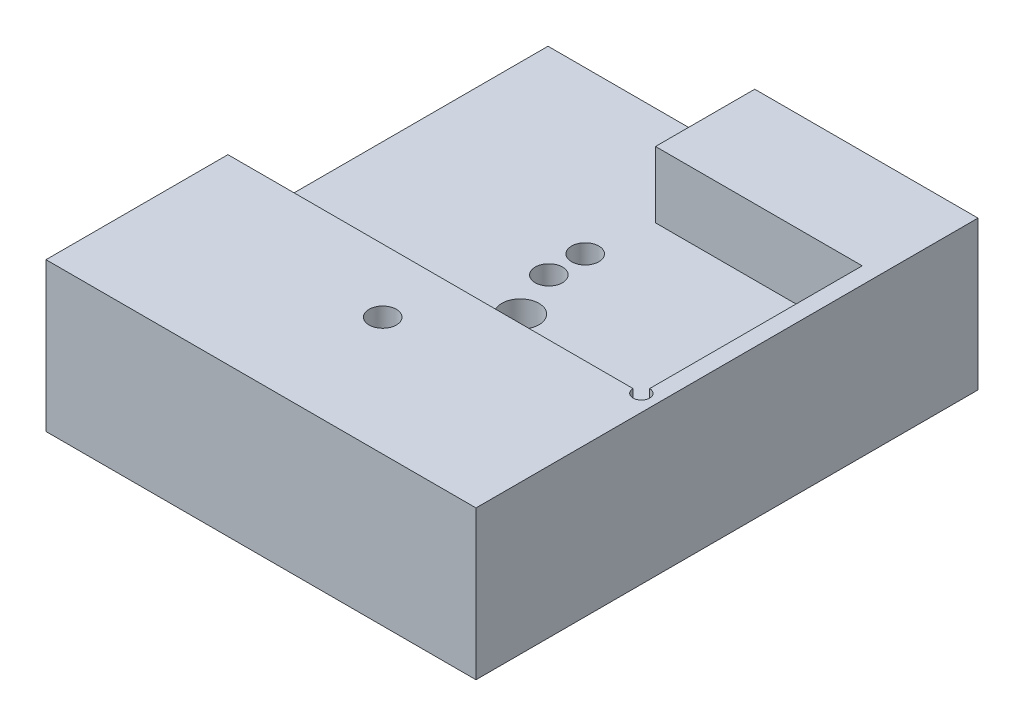
ISO-10303-21;
HEADER;
FILE_DESCRIPTION(('STEP AP214'),'2;1');
FILE_NAME('part.step','',(''),(''),'','','');
FILE_SCHEMA(('AUTOMOTIVE_DESIGN { 1 0 10303 214 1 1 1 1 }'));
ENDSEC;
DATA;
#1=APPLICATION_CONTEXT('core data for automotive mechanical design processes');
#2=APPLICATION_PROTOCOL_DEFINITION('international standard','automotive_design',2000,#1);
#3=PRODUCT_CONTEXT('',#1,'mechanical');
#4=PRODUCT('Part','Part','',(#3));
#5=PRODUCT_RELATED_PRODUCT_CATEGORY('part','',(#4));
#6=PRODUCT_DEFINITION_FORMATION('','',#4);
#7=PRODUCT_DEFINITION_CONTEXT('part definition',#1,'design');
#8=PRODUCT_DEFINITION('design','',#6,#7);
#9=PRODUCT_DEFINITION_SHAPE('','',#8);
#10=(LENGTH_UNIT() NAMED_UNIT(*) SI_UNIT(.MILLI.,.METRE.));
#11=(NAMED_UNIT(*) PLANE_ANGLE_UNIT() SI_UNIT($,.RADIAN.));
#12=(NAMED_UNIT(*) SI_UNIT($,.STERADIAN.) SOLID_ANGLE_UNIT());
#13=UNCERTAINTY_MEASURE_WITH_UNIT(LENGTH_MEASURE(1.E-05),#10,'distance_accuracy_value','');
#14=(GEOMETRIC_REPRESENTATION_CONTEXT(3) GLOBAL_UNCERTAINTY_ASSIGNED_CONTEXT((#13)) GLOBAL_UNIT_ASSIGNED_CONTEXT((#10,
#11,#12)) REPRESENTATION_CONTEXT('',''));
#15=CARTESIAN_POINT('',(0.,0.,0.));
#16=DIRECTION('',(0.,0.,1.));
#17=DIRECTION('',(1.,0.,0.));
#18=AXIS2_PLACEMENT_3D('',#15,#16,#17);
#19=CARTESIAN_POINT('',(-0.999999999999997,6.,-5.855));
#20=DIRECTION('',(0.,1.,0.));
#21=DIRECTION('',(0.,0.,1.));
#22=AXIS2_PLACEMENT_3D('',#19,#20,#21);
#23=CYLINDRICAL_SURFACE('',#22,1.64999999999999);
#24=CARTESIAN_POINT('',(-0.999999999999997,6.,-5.855));
#25=DIRECTION('',(0.,1.,0.));
#26=DIRECTION('',(0.,0.,1.));
#27=AXIS2_PLACEMENT_3D('',#24,#25,#26);
#28=CIRCLE('',#27,1.64999999999999);
#29=CARTESIAN_POINT('',(-0.999999999999997,6.,-4.20500000000001));
#30=VERTEX_POINT('',#29);
#31=EDGE_CURVE('E249',#30,#30,#28,.T.);
#32=ORIENTED_EDGE('',*,*,#31,.T.);
#33=EDGE_LOOP('',(#32));
#34=FACE_BOUND('',#33,.T.);
#35=CARTESIAN_POINT('',(-0.999999999999997,2.,-5.855));
#36=DIRECTION('',(0.,-1.,0.));
#37=DIRECTION('',(0.,0.,-1.));
#38=AXIS2_PLACEMENT_3D('',#35,#36,#37);
#39=CIRCLE('',#38,1.64999999999999);
#40=CARTESIAN_POINT('',(-0.999999999999997,2.,-7.50499999999999));
#41=VERTEX_POINT('',#40);
#42=EDGE_CURVE('E250',#41,#41,#39,.F.);
#43=ORIENTED_EDGE('',*,*,#42,.F.);
#44=EDGE_LOOP('',(#43));
#45=FACE_BOUND('',#44,.T.);
#46=ADVANCED_FACE('F41',(#34,#45),#23,.F.);
#47=CARTESIAN_POINT('',(25.,0.,-13.355));
#48=DIRECTION('',(0.,0.,1.));
#49=DIRECTION('',(1.,0.,0.));
#50=AXIS2_PLACEMENT_3D('',#47,#48,#49);
#51=PLANE('',#50);
#52=DIRECTION('',(1.,0.,0.));
#53=VECTOR('',#52,1.);
#54=CARTESIAN_POINT('',(25.,14.,-13.355));
#55=LINE('',#54,#53);
#56=CARTESIAN_POINT('',(0.,14.,-13.355));
#57=VERTEX_POINT('',#56);
#58=CARTESIAN_POINT('',(25.,14.,-13.355));
#59=VERTEX_POINT('',#58);
#60=EDGE_CURVE('E279',#57,#59,#55,.T.);
#61=ORIENTED_EDGE('',*,*,#60,.F.);
#62=DIRECTION('',(0.,1.,0.));
#63=VECTOR('',#62,1.);
#64=CARTESIAN_POINT('',(0.,6.,-13.355));
#65=LINE('',#64,#63);
#66=CARTESIAN_POINT('',(0.,6.,-13.355));
#67=VERTEX_POINT('',#66);
#68=EDGE_CURVE('E276',#67,#57,#65,.T.);
#69=ORIENTED_EDGE('',*,*,#68,.F.);
#70=DIRECTION('',(-1.,0.,0.));
#71=VECTOR('',#70,1.);
#72=CARTESIAN_POINT('',(-25.,6.,-13.355));
#73=LINE('',#72,#71);
#74=CARTESIAN_POINT('',(25.,6.,-13.355));
#75=VERTEX_POINT('',#74);
#76=EDGE_CURVE('E266',#75,#67,#73,.T.);
#77=ORIENTED_EDGE('',*,*,#76,.F.);
#78=DIRECTION('',(0.,1.,0.));
#79=VECTOR('',#78,1.);
#80=CARTESIAN_POINT('',(25.,0.,-13.355));
#81=LINE('',#80,#79);
#82=EDGE_CURVE('E270',#75,#59,#81,.T.);
#83=ORIENTED_EDGE('',*,*,#82,.T.);
#84=EDGE_LOOP('',(#61,#69,#77,#83));
#85=FACE_BOUND('',#84,.T.);
#86=ADVANCED_FACE('F371',(#85),#51,.T.);
#87=CARTESIAN_POINT('',(0.,14.,0.));
#88=DIRECTION('',(0.,1.,0.));
#89=DIRECTION('',(0.,0.,1.));
#90=AXIS2_PLACEMENT_3D('',#87,#88,#89);
#91=PLANE('',#90);
#92=CARTESIAN_POINT('',(1.38,14.,21.0159064092061));
#93=DIRECTION('',(0.,-1.,0.));
#94=DIRECTION('',(0.,0.,-1.));
#95=AXIS2_PLACEMENT_3D('',#92,#93,#94);
#96=CIRCLE('',#95,1.65);
#97=CARTESIAN_POINT('',(1.38,14.,19.3659064092061));
#98=VERTEX_POINT('',#97);
#99=EDGE_CURVE('E689',#98,#98,#96,.T.);
#100=ORIENTED_EDGE('',*,*,#99,.T.);
#101=EDGE_LOOP('',(#100));
#102=FACE_BOUND('',#101,.T.);
#103=CARTESIAN_POINT('',(25.,14.,13.355));
#104=DIRECTION('',(0.,1.,0.));
#105=DIRECTION('',(0.,0.,1.));
#106=AXIS2_PLACEMENT_3D('',#103,#104,#105);
#107=CIRCLE('',#106,1.);
#108=CARTESIAN_POINT('',(24.,14.,13.355));
#109=VERTEX_POINT('',#108);
#110=CARTESIAN_POINT('',(25.,14.,12.355));
#111=VERTEX_POINT('',#110);
#112=EDGE_CURVE('E257',#109,#111,#107,.T.);
#113=ORIENTED_EDGE('',*,*,#112,.F.);
#114=DIRECTION('',(-1.,0.,0.));
#115=VECTOR('',#114,1.);
#116=CARTESIAN_POINT('',(-25.,14.,13.355));
#117=LINE('',#116,#115);
#118=CARTESIAN_POINT('',(-25.,14.,13.355));
#119=VERTEX_POINT('',#118);
#120=EDGE_CURVE('E273',#109,#119,#117,.T.);
#121=ORIENTED_EDGE('',*,*,#120,.T.);
#122=DIRECTION('',(0.,0.,1.));
#123=VECTOR('',#122,1.);
#124=CARTESIAN_POINT('',(-25.,14.,15.355));
#125=LINE('',#124,#123);
#126=CARTESIAN_POINT('',(-25.,14.,35.355));
#127=VERTEX_POINT('',#126);
#128=EDGE_CURVE('E280',#119,#127,#125,.T.);
#129=ORIENTED_EDGE('',*,*,#128,.T.);
#130=DIRECTION('',(-1.,0.,0.));
#131=VECTOR('',#130,1.);
#132=CARTESIAN_POINT('',(27.,14.,35.355));
#133=LINE('',#132,#131);
#134=CARTESIAN_POINT('',(27.,14.,35.355));
#135=VERTEX_POINT('',#134);
#136=EDGE_CURVE('E311',#135,#127,#133,.T.);
#137=ORIENTED_EDGE('',*,*,#136,.F.);
#138=DIRECTION('',(0.,0.,-1.));
#139=VECTOR('',#138,1.);
#140=CARTESIAN_POINT('',(27.,14.,15.355));
#141=LINE('',#140,#139);
#142=CARTESIAN_POINT('',(27.,14.,-25.355));
#143=VERTEX_POINT('',#142);
#144=EDGE_CURVE('E277',#135,#143,#141,.T.);
#145=ORIENTED_EDGE('',*,*,#144,.T.);
#146=DIRECTION('',(1.,0.,0.));
#147=VECTOR('',#146,1.);
#148=CARTESIAN_POINT('',(0.,14.,-25.355));
#149=LINE('',#148,#147);
#150=CARTESIAN_POINT('',(0.,14.,-25.355));
#151=VERTEX_POINT('',#150);
#152=EDGE_CURVE('E297',#151,#143,#149,.T.);
#153=ORIENTED_EDGE('',*,*,#152,.F.);
#154=DIRECTION('',(0.,0.,-1.));
#155=VECTOR('',#154,1.);
#156=CARTESIAN_POINT('',(0.,14.,-13.355));
#157=LINE('',#156,#155);
#158=EDGE_CURVE('E291',#57,#151,#157,.T.);
#159=ORIENTED_EDGE('',*,*,#158,.F.);
#160=ORIENTED_EDGE('',*,*,#60,.T.);
#161=DIRECTION('',(0.,0.,1.));
#162=VECTOR('',#161,1.);
#163=CARTESIAN_POINT('',(25.,14.,13.355));
#164=LINE('',#163,#162);
#165=EDGE_CURVE('E262',#59,#111,#164,.T.);
#166=ORIENTED_EDGE('',*,*,#165,.T.);
#167=EDGE_LOOP('',(#113,#121,#129,#137,#145,#153,#159,#160,#166));
#168=FACE_BOUND('',#167,.T.);
#169=ADVANCED_FACE('F377',(#102,#168),#91,.T.);
#170=CARTESIAN_POINT('',(-25.,6.,-13.355));
#171=DIRECTION('',(1.,0.,0.));
#172=DIRECTION('',(0.,0.,-1.));
#173=AXIS2_PLACEMENT_3D('',#170,#171,#172);
#174=PLANE('',#173);
#175=DIRECTION('',(0.,0.,1.));
#176=VECTOR('',#175,1.);
#177=CARTESIAN_POINT('',(-25.,6.,-13.355));
#178=LINE('',#177,#176);
#179=CARTESIAN_POINT('',(-25.,6.,-25.355));
#180=VERTEX_POINT('',#179);
#181=CARTESIAN_POINT('',(-25.,6.,13.355));
#182=VERTEX_POINT('',#181);
#183=EDGE_CURVE('E263',#180,#182,#178,.T.);
#184=ORIENTED_EDGE('',*,*,#183,.F.);
#185=DIRECTION('',(0.,1.,0.));
#186=VECTOR('',#185,1.);
#187=CARTESIAN_POINT('',(-25.,0.,-25.355));
#188=LINE('',#187,#186);
#189=CARTESIAN_POINT('',(-25.,-4.,-25.355));
#190=VERTEX_POINT('',#189);
#191=EDGE_CURVE('E290',#190,#180,#188,.T.);
#192=ORIENTED_EDGE('',*,*,#191,.F.);
#193=DIRECTION('',(0.,0.,-1.));
#194=VECTOR('',#193,1.);
#195=CARTESIAN_POINT('',(-25.,-4.,35.355));
#196=LINE('',#195,#194);
#197=CARTESIAN_POINT('',(-25.,-4.,35.355));
#198=VERTEX_POINT('',#197);
#199=EDGE_CURVE('E243',#198,#190,#196,.T.);
#200=ORIENTED_EDGE('',*,*,#199,.F.);
#201=DIRECTION('',(0.,-1.,0.));
#202=VECTOR('',#201,1.);
#203=CARTESIAN_POINT('',(-25.,14.,35.355));
#204=LINE('',#203,#202);
#205=EDGE_CURVE('E308',#127,#198,#204,.T.);
#206=ORIENTED_EDGE('',*,*,#205,.F.);
#207=ORIENTED_EDGE('',*,*,#128,.F.);
#208=DIRECTION('',(0.,1.,0.));
#209=VECTOR('',#208,1.);
#210=CARTESIAN_POINT('',(-25.,0.,13.355));
#211=LINE('',#210,#209);
#212=EDGE_CURVE('E265',#182,#119,#211,.T.);
#213=ORIENTED_EDGE('',*,*,#212,.F.);
#214=EDGE_LOOP('',(#184,#192,#200,#206,#207,#213));
#215=FACE_BOUND('',#214,.T.);
#216=ADVANCED_FACE('F510',(#215),#174,.F.);
#217=CARTESIAN_POINT('',(0.,6.,0.));
#218=DIRECTION('',(0.,1.,0.));
#219=DIRECTION('',(0.,0.,1.));
#220=AXIS2_PLACEMENT_3D('',#217,#218,#219);
#221=PLANE('',#220);
#222=CARTESIAN_POINT('',(1.378,6.,4.36948924411358));
#223=DIRECTION('',(0.,1.,0.));
#224=DIRECTION('',(0.,0.,1.));
#225=AXIS2_PLACEMENT_3D('',#222,#223,#224);
#226=CIRCLE('',#225,2.25);
#227=CARTESIAN_POINT('',(1.378,6.,6.61948924411359));
#228=VERTEX_POINT('',#227);
#229=EDGE_CURVE('E208',#228,#228,#226,.T.);
#230=ORIENTED_EDGE('',*,*,#229,.F.);
#231=EDGE_LOOP('',(#230));
#232=FACE_BOUND('',#231,.T.);
#233=CARTESIAN_POINT('',(-1.,6.,-1.455));
#234=DIRECTION('',(0.,1.,0.));
#235=DIRECTION('',(0.,0.,1.));
#236=AXIS2_PLACEMENT_3D('',#233,#234,#235);
#237=CIRCLE('',#236,1.64999999999999);
#238=CARTESIAN_POINT('',(-1.,6.,0.194999999999991));
#239=VERTEX_POINT('',#238);
#240=EDGE_CURVE('E321',#239,#239,#237,.T.);
#241=ORIENTED_EDGE('',*,*,#240,.F.);
#242=EDGE_LOOP('',(#241));
#243=FACE_BOUND('',#242,.T.);
#244=DIRECTION('',(1.,0.,0.));
#245=VECTOR('',#244,1.);
#246=CARTESIAN_POINT('',(-25.,6.,13.355));
#247=LINE('',#246,#245);
#248=CARTESIAN_POINT('',(24.,6.,13.355));
#249=VERTEX_POINT('',#248);
#250=EDGE_CURVE('E258',#182,#249,#247,.T.);
#251=ORIENTED_EDGE('',*,*,#250,.T.);
#252=CARTESIAN_POINT('',(25.,6.,13.355));
#253=DIRECTION('',(0.,1.,0.));
#254=DIRECTION('',(0.,0.,1.));
#255=AXIS2_PLACEMENT_3D('',#252,#253,#254);
#256=CIRCLE('',#255,1.);
#257=CARTESIAN_POINT('',(25.,6.,12.355));
#258=VERTEX_POINT('',#257);
#259=EDGE_CURVE('E88',#258,#249,#256,.F.);
#260=ORIENTED_EDGE('',*,*,#259,.F.);
#261=DIRECTION('',(0.,0.,-1.));
#262=VECTOR('',#261,1.);
#263=CARTESIAN_POINT('',(25.,6.,-13.355));
#264=LINE('',#263,#262);
#265=EDGE_CURVE('E261',#258,#75,#264,.T.);
#266=ORIENTED_EDGE('',*,*,#265,.T.);
#267=ORIENTED_EDGE('',*,*,#76,.T.);
#268=DIRECTION('',(0.,0.,1.));
#269=VECTOR('',#268,1.);
#270=CARTESIAN_POINT('',(0.,6.,-13.355));
#271=LINE('',#270,#269);
#272=CARTESIAN_POINT('',(0.,6.,-25.355));
#273=VERTEX_POINT('',#272);
#274=EDGE_CURVE('E288',#273,#67,#271,.T.);
#275=ORIENTED_EDGE('',*,*,#274,.F.);
#276=DIRECTION('',(1.,0.,0.));
#277=VECTOR('',#276,1.);
#278=CARTESIAN_POINT('',(-25.,6.,-25.355));
#279=LINE('',#278,#277);
#280=EDGE_CURVE('E303',#180,#273,#279,.T.);
#281=ORIENTED_EDGE('',*,*,#280,.F.);
#282=ORIENTED_EDGE('',*,*,#183,.T.);
#283=EDGE_LOOP('',(#251,#260,#266,#267,#275,#281,#282));
#284=FACE_BOUND('',#283,.T.);
#285=ORIENTED_EDGE('',*,*,#31,.F.);
#286=EDGE_LOOP('',(#285));
#287=FACE_BOUND('',#286,.T.);
#288=ADVANCED_FACE('F505',(#232,#243,#284,#287),#221,.T.);
#289=CARTESIAN_POINT('',(27.,0.,15.355));
#290=DIRECTION('',(1.,0.,0.));
#291=DIRECTION('',(0.,0.,-1.));
#292=AXIS2_PLACEMENT_3D('',#289,#290,#291);
#293=PLANE('',#292);
#294=DIRECTION('',(0.,1.,0.));
#295=VECTOR('',#294,1.);
#296=CARTESIAN_POINT('',(27.,0.,35.355));
#297=LINE('',#296,#295);
#298=CARTESIAN_POINT('',(27.,-4.,35.355));
#299=VERTEX_POINT('',#298);
#300=EDGE_CURVE('E296',#299,#135,#297,.T.);
#301=ORIENTED_EDGE('',*,*,#300,.F.);
#302=DIRECTION('',(0.,0.,1.));
#303=VECTOR('',#302,1.);
#304=CARTESIAN_POINT('',(27.,-4.,-25.355));
#305=LINE('',#304,#303);
#306=CARTESIAN_POINT('',(27.,-4.,-25.355));
#307=VERTEX_POINT('',#306);
#308=EDGE_CURVE('E237',#307,#299,#305,.T.);
#309=ORIENTED_EDGE('',*,*,#308,.F.);
#310=DIRECTION('',(0.,-1.,0.));
#311=VECTOR('',#310,1.);
#312=CARTESIAN_POINT('',(27.,14.,-25.355));
#313=LINE('',#312,#311);
#314=EDGE_CURVE('E294',#143,#307,#313,.T.);
#315=ORIENTED_EDGE('',*,*,#314,.F.);
#316=ORIENTED_EDGE('',*,*,#144,.F.);
#317=EDGE_LOOP('',(#301,#309,#315,#316));
#318=FACE_BOUND('',#317,.T.);
#319=ADVANCED_FACE('F509',(#318),#293,.T.);
#320=CARTESIAN_POINT('',(-25.,0.,13.355));
#321=DIRECTION('',(0.,0.,-1.));
#322=DIRECTION('',(-1.,0.,0.));
#323=AXIS2_PLACEMENT_3D('',#320,#321,#322);
#324=PLANE('',#323);
#325=DIRECTION('',(0.,1.,0.));
#326=VECTOR('',#325,1.);
#327=CARTESIAN_POINT('',(24.,3.17157287525381,13.355));
#328=LINE('',#327,#326);
#329=EDGE_CURVE('E310',#249,#109,#328,.T.);
#330=ORIENTED_EDGE('',*,*,#329,.F.);
#331=ORIENTED_EDGE('',*,*,#250,.F.);
#332=ORIENTED_EDGE('',*,*,#212,.T.);
#333=ORIENTED_EDGE('',*,*,#120,.F.);
#334=EDGE_LOOP('',(#330,#331,#332,#333));
#335=FACE_BOUND('',#334,.T.);
#336=ADVANCED_FACE('F544',(#335),#324,.T.);
#337=CARTESIAN_POINT('',(25.,0.,13.355));
#338=DIRECTION('',(-1.,0.,0.));
#339=DIRECTION('',(0.,0.,1.));
#340=AXIS2_PLACEMENT_3D('',#337,#338,#339);
#341=PLANE('',#340);
#342=DIRECTION('',(0.,1.,0.));
#343=VECTOR('',#342,1.);
#344=CARTESIAN_POINT('',(25.,3.17157287525381,12.355));
#345=LINE('',#344,#343);
#346=EDGE_CURVE('E255',#111,#258,#345,.F.);
#347=ORIENTED_EDGE('',*,*,#346,.F.);
#348=ORIENTED_EDGE('',*,*,#165,.F.);
#349=ORIENTED_EDGE('',*,*,#82,.F.);
#350=ORIENTED_EDGE('',*,*,#265,.F.);
#351=EDGE_LOOP('',(#347,#348,#349,#350));
#352=FACE_BOUND('',#351,.T.);
#353=ADVANCED_FACE('F387',(#352),#341,.T.);
#354=CARTESIAN_POINT('',(0.,0.,0.));
#355=DIRECTION('',(-1.,0.,0.));
#356=DIRECTION('',(0.,0.,1.));
#357=AXIS2_PLACEMENT_3D('',#354,#355,#356);
#358=PLANE('',#357);
#359=ORIENTED_EDGE('',*,*,#68,.T.);
#360=ORIENTED_EDGE('',*,*,#158,.T.);
#361=DIRECTION('',(0.,1.,0.));
#362=VECTOR('',#361,1.);
#363=CARTESIAN_POINT('',(0.,6.,-25.355));
#364=LINE('',#363,#362);
#365=EDGE_CURVE('E300',#273,#151,#364,.T.);
#366=ORIENTED_EDGE('',*,*,#365,.F.);
#367=ORIENTED_EDGE('',*,*,#274,.T.);
#368=EDGE_LOOP('',(#359,#360,#366,#367));
#369=FACE_BOUND('',#368,.T.);
#370=ADVANCED_FACE('F383',(#369),#358,.T.);
#371=CARTESIAN_POINT('',(0.,0.,-25.355));
#372=DIRECTION('',(0.,0.,-1.));
#373=DIRECTION('',(-1.,0.,0.));
#374=AXIS2_PLACEMENT_3D('',#371,#372,#373);
#375=PLANE('',#374);
#376=ORIENTED_EDGE('',*,*,#191,.T.);
#377=ORIENTED_EDGE('',*,*,#280,.T.);
#378=ORIENTED_EDGE('',*,*,#365,.T.);
#379=ORIENTED_EDGE('',*,*,#152,.T.);
#380=ORIENTED_EDGE('',*,*,#314,.T.);
#381=DIRECTION('',(1.,0.,0.));
#382=VECTOR('',#381,1.);
#383=CARTESIAN_POINT('',(-25.,-4.,-25.355));
#384=LINE('',#383,#382);
#385=EDGE_CURVE('E246',#190,#307,#384,.T.);
#386=ORIENTED_EDGE('',*,*,#385,.F.);
#387=EDGE_LOOP('',(#376,#377,#378,#379,#380,#386));
#388=FACE_BOUND('',#387,.T.);
#389=ADVANCED_FACE('F386',(#388),#375,.T.);
#390=CARTESIAN_POINT('',(0.,0.,35.355));
#391=DIRECTION('',(0.,0.,1.));
#392=DIRECTION('',(1.,0.,0.));
#393=AXIS2_PLACEMENT_3D('',#390,#391,#392);
#394=PLANE('',#393);
#395=ORIENTED_EDGE('',*,*,#205,.T.);
#396=DIRECTION('',(-1.,0.,0.));
#397=VECTOR('',#396,1.);
#398=CARTESIAN_POINT('',(27.,-4.,35.355));
#399=LINE('',#398,#397);
#400=EDGE_CURVE('E240',#299,#198,#399,.T.);
#401=ORIENTED_EDGE('',*,*,#400,.F.);
#402=ORIENTED_EDGE('',*,*,#300,.T.);
#403=ORIENTED_EDGE('',*,*,#136,.T.);
#404=EDGE_LOOP('',(#395,#401,#402,#403));
#405=FACE_BOUND('',#404,.T.);
#406=ADVANCED_FACE('F391',(#405),#394,.T.);
#407=CARTESIAN_POINT('',(25.,3.17157287525381,13.355));
#408=DIRECTION('',(0.,1.,0.));
#409=DIRECTION('',(0.,0.,1.));
#410=AXIS2_PLACEMENT_3D('',#407,#408,#409);
#411=CYLINDRICAL_SURFACE('',#410,1.);
#412=ORIENTED_EDGE('',*,*,#329,.T.);
#413=ORIENTED_EDGE('',*,*,#112,.T.);
#414=ORIENTED_EDGE('',*,*,#346,.T.);
#415=ORIENTED_EDGE('',*,*,#259,.T.);
#416=EDGE_LOOP('',(#412,#413,#414,#415));
#417=FACE_BOUND('',#416,.T.);
#418=ADVANCED_FACE('F366',(#417),#411,.F.);
#419=CARTESIAN_POINT('',(0.,2.,0.));
#420=DIRECTION('',(0.,-1.,0.));
#421=DIRECTION('',(0.,0.,-1.));
#422=AXIS2_PLACEMENT_3D('',#419,#420,#421);
#423=PLANE('',#422);
#424=CARTESIAN_POINT('',(1.378,2.,4.36948924411358));
#425=DIRECTION('',(0.,-1.,0.));
#426=DIRECTION('',(0.,0.,-1.));
#427=AXIS2_PLACEMENT_3D('',#424,#425,#426);
#428=CIRCLE('',#427,2.25);
#429=CARTESIAN_POINT('',(1.378,2.,2.11948924411358));
#430=VERTEX_POINT('',#429);
#431=EDGE_CURVE('E45',#430,#430,#428,.T.);
#432=ORIENTED_EDGE('',*,*,#431,.F.);
#433=EDGE_LOOP('',(#432));
#434=FACE_BOUND('',#433,.T.);
#435=CARTESIAN_POINT('',(-1.,2.,-1.455));
#436=DIRECTION('',(0.,-1.,0.));
#437=DIRECTION('',(0.,0.,-1.));
#438=AXIS2_PLACEMENT_3D('',#435,#436,#437);
#439=CIRCLE('',#438,1.64999999999999);
#440=CARTESIAN_POINT('',(-1.,2.,-3.10499999999999));
#441=VERTEX_POINT('',#440);
#442=EDGE_CURVE('E338',#441,#441,#439,.T.);
#443=ORIENTED_EDGE('',*,*,#442,.F.);
#444=EDGE_LOOP('',(#443));
#445=FACE_BOUND('',#444,.T.);
#446=DIRECTION('',(0.,0.,1.));
#447=VECTOR('',#446,1.);
#448=CARTESIAN_POINT('',(11.5,2.,11.045));
#449=LINE('',#448,#447);
#450=CARTESIAN_POINT('',(11.5,2.,-13.955));
#451=VERTEX_POINT('',#450);
#452=CARTESIAN_POINT('',(11.5,2.,11.045));
#453=VERTEX_POINT('',#452);
#454=EDGE_CURVE('E318',#451,#453,#449,.T.);
#455=ORIENTED_EDGE('',*,*,#454,.T.);
#456=DIRECTION('',(-1.,0.,0.));
#457=VECTOR('',#456,1.);
#458=CARTESIAN_POINT('',(-13.5,2.,11.045));
#459=LINE('',#458,#457);
#460=CARTESIAN_POINT('',(-13.5,2.,11.045));
#461=VERTEX_POINT('',#460);
#462=EDGE_CURVE('E331',#453,#461,#459,.T.);
#463=ORIENTED_EDGE('',*,*,#462,.T.);
#464=DIRECTION('',(0.,0.,-1.));
#465=VECTOR('',#464,1.);
#466=CARTESIAN_POINT('',(-13.5,2.,11.045));
#467=LINE('',#466,#465);
#468=CARTESIAN_POINT('',(-13.5,2.,-13.955));
#469=VERTEX_POINT('',#468);
#470=EDGE_CURVE('E328',#461,#469,#467,.T.);
#471=ORIENTED_EDGE('',*,*,#470,.T.);
#472=DIRECTION('',(1.,0.,0.));
#473=VECTOR('',#472,1.);
#474=CARTESIAN_POINT('',(-13.5,2.,-13.955));
#475=LINE('',#474,#473);
#476=EDGE_CURVE('E254',#469,#451,#475,.T.);
#477=ORIENTED_EDGE('',*,*,#476,.T.);
#478=EDGE_LOOP('',(#455,#463,#471,#477));
#479=FACE_BOUND('',#478,.T.);
#480=ORIENTED_EDGE('',*,*,#42,.T.);
#481=EDGE_LOOP('',(#480));
#482=FACE_BOUND('',#481,.T.);
#483=ADVANCED_FACE('F363',(#434,#445,#479,#482),#423,.T.);
#484=CARTESIAN_POINT('',(11.5,2.,11.045));
#485=DIRECTION('',(1.,0.,0.));
#486=DIRECTION('',(0.,0.,-1.));
#487=AXIS2_PLACEMENT_3D('',#484,#485,#486);
#488=PLANE('',#487);
#489=DIRECTION('',(0.,0.,1.));
#490=VECTOR('',#489,1.);
#491=CARTESIAN_POINT('',(11.5,-4.,-13.955));
#492=LINE('',#491,#490);
#493=CARTESIAN_POINT('',(11.5,-4.,-13.955));
#494=VERTEX_POINT('',#493);
#495=CARTESIAN_POINT('',(11.5,-4.,8.865));
#496=VERTEX_POINT('',#495);
#497=EDGE_CURVE('E234',#494,#496,#492,.T.);
#498=ORIENTED_EDGE('',*,*,#497,.T.);
#499=DIRECTION('',(0.,1.,0.));
#500=VECTOR('',#499,1.);
#501=CARTESIAN_POINT('',(11.5,2.,8.865));
#502=LINE('',#501,#500);
#503=CARTESIAN_POINT('',(11.5,-2.16,8.865));
#504=VERTEX_POINT('',#503);
#505=EDGE_CURVE('E221',#496,#504,#502,.T.);
#506=ORIENTED_EDGE('',*,*,#505,.T.);
#507=DIRECTION('',(0.,0.,-1.));
#508=VECTOR('',#507,1.);
#509=CARTESIAN_POINT('',(11.5,-2.16,11.045));
#510=LINE('',#509,#508);
#511=CARTESIAN_POINT('',(11.5,-2.16,11.045));
#512=VERTEX_POINT('',#511);
#513=EDGE_CURVE('E224',#512,#504,#510,.T.);
#514=ORIENTED_EDGE('',*,*,#513,.F.);
#515=DIRECTION('',(0.,-1.,0.));
#516=VECTOR('',#515,1.);
#517=CARTESIAN_POINT('',(11.5,2.,11.045));
#518=LINE('',#517,#516);
#519=EDGE_CURVE('E79',#453,#512,#518,.T.);
#520=ORIENTED_EDGE('',*,*,#519,.F.);
#521=ORIENTED_EDGE('',*,*,#454,.F.);
#522=DIRECTION('',(0.,-1.,0.));
#523=VECTOR('',#522,1.);
#524=CARTESIAN_POINT('',(11.5,2.,-13.955));
#525=LINE('',#524,#523);
#526=EDGE_CURVE('E253',#451,#494,#525,.T.);
#527=ORIENTED_EDGE('',*,*,#526,.T.);
#528=EDGE_LOOP('',(#498,#506,#514,#520,#521,#527));
#529=FACE_BOUND('',#528,.T.);
#530=ADVANCED_FACE('F355',(#529),#488,.F.);
#531=CARTESIAN_POINT('',(-13.5,2.,-13.955));
#532=DIRECTION('',(0.,0.,-1.));
#533=DIRECTION('',(-1.,0.,0.));
#534=AXIS2_PLACEMENT_3D('',#531,#532,#533);
#535=PLANE('',#534);
#536=DIRECTION('',(0.,-1.,0.));
#537=VECTOR('',#536,1.);
#538=CARTESIAN_POINT('',(-13.5,2.,-13.955));
#539=LINE('',#538,#537);
#540=CARTESIAN_POINT('',(-13.5,-4.,-13.955));
#541=VERTEX_POINT('',#540);
#542=EDGE_CURVE('E323',#469,#541,#539,.T.);
#543=ORIENTED_EDGE('',*,*,#542,.T.);
#544=DIRECTION('',(1.,0.,0.));
#545=VECTOR('',#544,1.);
#546=CARTESIAN_POINT('',(-13.5,-4.,-13.955));
#547=LINE('',#546,#545);
#548=EDGE_CURVE('E231',#541,#494,#547,.T.);
#549=ORIENTED_EDGE('',*,*,#548,.T.);
#550=ORIENTED_EDGE('',*,*,#526,.F.);
#551=ORIENTED_EDGE('',*,*,#476,.F.);
#552=EDGE_LOOP('',(#543,#549,#550,#551));
#553=FACE_BOUND('',#552,.T.);
#554=ADVANCED_FACE('F358',(#553),#535,.F.);
#555=CARTESIAN_POINT('',(-13.5,2.,11.045));
#556=DIRECTION('',(-1.,0.,0.));
#557=DIRECTION('',(0.,0.,1.));
#558=AXIS2_PLACEMENT_3D('',#555,#556,#557);
#559=PLANE('',#558);
#560=DIRECTION('',(0.,-1.,0.));
#561=VECTOR('',#560,1.);
#562=CARTESIAN_POINT('',(-13.5,2.,11.045));
#563=LINE('',#562,#561);
#564=CARTESIAN_POINT('',(-13.5,-4.,11.045));
#565=VERTEX_POINT('',#564);
#566=EDGE_CURVE('E66',#461,#565,#563,.T.);
#567=ORIENTED_EDGE('',*,*,#566,.T.);
#568=DIRECTION('',(0.,0.,-1.));
#569=VECTOR('',#568,1.);
#570=CARTESIAN_POINT('',(-13.5,-4.,11.045));
#571=LINE('',#570,#569);
#572=EDGE_CURVE('E228',#565,#541,#571,.T.);
#573=ORIENTED_EDGE('',*,*,#572,.T.);
#574=ORIENTED_EDGE('',*,*,#542,.F.);
#575=ORIENTED_EDGE('',*,*,#470,.F.);
#576=EDGE_LOOP('',(#567,#573,#574,#575));
#577=FACE_BOUND('',#576,.T.);
#578=ADVANCED_FACE('F361',(#577),#559,.F.);
#579=CARTESIAN_POINT('',(-13.5,2.,11.045));
#580=DIRECTION('',(0.,0.,1.));
#581=DIRECTION('',(1.,0.,0.));
#582=AXIS2_PLACEMENT_3D('',#579,#580,#581);
#583=PLANE('',#582);
#584=DIRECTION('',(1.,0.,0.));
#585=VECTOR('',#584,1.);
#586=CARTESIAN_POINT('',(-13.5,-2.16,11.045));
#587=LINE('',#586,#585);
#588=CARTESIAN_POINT('',(-11.12,-2.16,11.045));
#589=VERTEX_POINT('',#588);
#590=EDGE_CURVE('E11',#589,#512,#587,.T.);
#591=ORIENTED_EDGE('',*,*,#590,.F.);
#592=DIRECTION('',(0.,-1.,0.));
#593=VECTOR('',#592,1.);
#594=CARTESIAN_POINT('',(-11.12,2.,11.045));
#595=LINE('',#594,#593);
#596=CARTESIAN_POINT('',(-11.12,-4.,11.045));
#597=VERTEX_POINT('',#596);
#598=EDGE_CURVE('E217',#589,#597,#595,.T.);
#599=ORIENTED_EDGE('',*,*,#598,.T.);
#600=DIRECTION('',(-1.,0.,0.));
#601=VECTOR('',#600,1.);
#602=CARTESIAN_POINT('',(11.5,-4.,11.045));
#603=LINE('',#602,#601);
#604=EDGE_CURVE('E226',#597,#565,#603,.T.);
#605=ORIENTED_EDGE('',*,*,#604,.T.);
#606=ORIENTED_EDGE('',*,*,#566,.F.);
#607=ORIENTED_EDGE('',*,*,#462,.F.);
#608=ORIENTED_EDGE('',*,*,#519,.T.);
#609=EDGE_LOOP('',(#591,#599,#605,#606,#607,#608));
#610=FACE_BOUND('',#609,.T.);
#611=ADVANCED_FACE('F354',(#610),#583,.F.);
#612=CARTESIAN_POINT('',(-1.,2.,-1.455));
#613=DIRECTION('',(0.,-1.,0.));
#614=DIRECTION('',(0.,0.,-1.));
#615=AXIS2_PLACEMENT_3D('',#612,#613,#614);
#616=CYLINDRICAL_SURFACE('',#615,1.64999999999999);
#617=ORIENTED_EDGE('',*,*,#240,.T.);
#618=EDGE_LOOP('',(#617));
#619=FACE_BOUND('',#618,.T.);
#620=ORIENTED_EDGE('',*,*,#442,.T.);
#621=EDGE_LOOP('',(#620));
#622=FACE_BOUND('',#621,.T.);
#623=ADVANCED_FACE('F43',(#619,#622),#616,.F.);
#624=CARTESIAN_POINT('',(0.,-4.,0.));
#625=DIRECTION('',(0.,-1.,0.));
#626=DIRECTION('',(0.,0.,-1.));
#627=AXIS2_PLACEMENT_3D('',#624,#625,#626);
#628=PLANE('',#627);
#629=DIRECTION('',(1.,0.,0.));
#630=VECTOR('',#629,1.);
#631=CARTESIAN_POINT('',(0.,-4.,8.865));
#632=LINE('',#631,#630);
#633=CARTESIAN_POINT('',(13.88,-4.,8.865));
#634=VERTEX_POINT('',#633);
#635=EDGE_CURVE('E50',#496,#634,#632,.T.);
#636=ORIENTED_EDGE('',*,*,#635,.F.);
#637=ORIENTED_EDGE('',*,*,#497,.F.);
#638=ORIENTED_EDGE('',*,*,#548,.F.);
#639=ORIENTED_EDGE('',*,*,#572,.F.);
#640=ORIENTED_EDGE('',*,*,#604,.F.);
#641=DIRECTION('',(0.,0.,-1.));
#642=VECTOR('',#641,1.);
#643=CARTESIAN_POINT('',(-11.12,-4.,33.865));
#644=LINE('',#643,#642);
#645=CARTESIAN_POINT('',(-11.12,-4.,33.865));
#646=VERTEX_POINT('',#645);
#647=EDGE_CURVE('E203',#646,#597,#644,.T.);
#648=ORIENTED_EDGE('',*,*,#647,.F.);
#649=DIRECTION('',(-1.,0.,0.));
#650=VECTOR('',#649,1.);
#651=CARTESIAN_POINT('',(-11.12,-4.,33.865));
#652=LINE('',#651,#650);
#653=CARTESIAN_POINT('',(13.88,-4.,33.865));
#654=VERTEX_POINT('',#653);
#655=EDGE_CURVE('E205',#654,#646,#652,.T.);
#656=ORIENTED_EDGE('',*,*,#655,.F.);
#657=DIRECTION('',(0.,0.,1.));
#658=VECTOR('',#657,1.);
#659=CARTESIAN_POINT('',(13.88,-4.,33.865));
#660=LINE('',#659,#658);
#661=EDGE_CURVE('E57',#634,#654,#660,.T.);
#662=ORIENTED_EDGE('',*,*,#661,.F.);
#663=EDGE_LOOP('',(#636,#637,#638,#639,#640,#648,#656,#662));
#664=FACE_BOUND('',#663,.T.);
#665=ORIENTED_EDGE('',*,*,#308,.T.);
#666=ORIENTED_EDGE('',*,*,#400,.T.);
#667=ORIENTED_EDGE('',*,*,#199,.T.);
#668=ORIENTED_EDGE('',*,*,#385,.T.);
#669=EDGE_LOOP('',(#665,#666,#667,#668));
#670=FACE_BOUND('',#669,.T.);
#671=ADVANCED_FACE('F346',(#664,#670),#628,.T.);
#672=CARTESIAN_POINT('',(0.,-2.16,0.));
#673=DIRECTION('',(0.,-1.,0.));
#674=DIRECTION('',(0.,0.,-1.));
#675=AXIS2_PLACEMENT_3D('',#672,#673,#674);
#676=PLANE('',#675);
#677=CARTESIAN_POINT('',(1.38,-2.16,21.0159064092061));
#678=DIRECTION('',(0.,-1.,0.));
#679=DIRECTION('',(0.,0.,-1.));
#680=AXIS2_PLACEMENT_3D('',#677,#678,#679);
#681=CIRCLE('',#680,1.65);
#682=CARTESIAN_POINT('',(1.38,-2.16,19.3659064092061));
#683=VERTEX_POINT('',#682);
#684=EDGE_CURVE('E716',#683,#683,#681,.T.);
#685=ORIENTED_EDGE('',*,*,#684,.F.);
#686=EDGE_LOOP('',(#685));
#687=FACE_BOUND('',#686,.T.);
#688=ORIENTED_EDGE('',*,*,#513,.T.);
#689=DIRECTION('',(1.,0.,0.));
#690=VECTOR('',#689,1.);
#691=CARTESIAN_POINT('',(-11.12,-2.16,8.865));
#692=LINE('',#691,#690);
#693=CARTESIAN_POINT('',(13.88,-2.16,8.865));
#694=VERTEX_POINT('',#693);
#695=EDGE_CURVE('E190',#504,#694,#692,.T.);
#696=ORIENTED_EDGE('',*,*,#695,.T.);
#697=DIRECTION('',(0.,0.,1.));
#698=VECTOR('',#697,1.);
#699=CARTESIAN_POINT('',(13.88,-2.16,33.865));
#700=LINE('',#699,#698);
#701=CARTESIAN_POINT('',(13.88,-2.16,33.865));
#702=VERTEX_POINT('',#701);
#703=EDGE_CURVE('E185',#694,#702,#700,.T.);
#704=ORIENTED_EDGE('',*,*,#703,.T.);
#705=DIRECTION('',(-1.,0.,0.));
#706=VECTOR('',#705,1.);
#707=CARTESIAN_POINT('',(-11.12,-2.16,33.865));
#708=LINE('',#707,#706);
#709=CARTESIAN_POINT('',(-11.12,-2.16,33.865));
#710=VERTEX_POINT('',#709);
#711=EDGE_CURVE('E193',#702,#710,#708,.T.);
#712=ORIENTED_EDGE('',*,*,#711,.T.);
#713=DIRECTION('',(0.,0.,-1.));
#714=VECTOR('',#713,1.);
#715=CARTESIAN_POINT('',(-11.12,-2.16,33.865));
#716=LINE('',#715,#714);
#717=EDGE_CURVE('E198',#710,#589,#716,.T.);
#718=ORIENTED_EDGE('',*,*,#717,.T.);
#719=ORIENTED_EDGE('',*,*,#590,.T.);
#720=EDGE_LOOP('',(#688,#696,#704,#712,#718,#719));
#721=FACE_BOUND('',#720,.T.);
#722=ADVANCED_FACE('F200',(#687,#721),#676,.T.);
#723=CARTESIAN_POINT('',(-11.12,-2.16,8.865));
#724=DIRECTION('',(0.,0.,-1.));
#725=DIRECTION('',(-1.,0.,0.));
#726=AXIS2_PLACEMENT_3D('',#723,#724,#725);
#727=PLANE('',#726);
#728=ORIENTED_EDGE('',*,*,#635,.T.);
#729=DIRECTION('',(0.,-1.,0.));
#730=VECTOR('',#729,1.);
#731=CARTESIAN_POINT('',(13.88,-2.16,8.865));
#732=LINE('',#731,#730);
#733=EDGE_CURVE('E215',#694,#634,#732,.T.);
#734=ORIENTED_EDGE('',*,*,#733,.F.);
#735=ORIENTED_EDGE('',*,*,#695,.F.);
#736=ORIENTED_EDGE('',*,*,#505,.F.);
#737=EDGE_LOOP('',(#728,#734,#735,#736));
#738=FACE_BOUND('',#737,.T.);
#739=ADVANCED_FACE('F343',(#738),#727,.F.);
#740=CARTESIAN_POINT('',(-11.12,-2.16,33.865));
#741=DIRECTION('',(-1.,0.,0.));
#742=DIRECTION('',(0.,0.,1.));
#743=AXIS2_PLACEMENT_3D('',#740,#741,#742);
#744=PLANE('',#743);
#745=ORIENTED_EDGE('',*,*,#717,.F.);
#746=DIRECTION('',(0.,-1.,0.));
#747=VECTOR('',#746,1.);
#748=CARTESIAN_POINT('',(-11.12,-2.16,33.865));
#749=LINE('',#748,#747);
#750=EDGE_CURVE('E189',#710,#646,#749,.T.);
#751=ORIENTED_EDGE('',*,*,#750,.T.);
#752=ORIENTED_EDGE('',*,*,#647,.T.);
#753=ORIENTED_EDGE('',*,*,#598,.F.);
#754=EDGE_LOOP('',(#745,#751,#752,#753));
#755=FACE_BOUND('',#754,.T.);
#756=ADVANCED_FACE('F352',(#755),#744,.F.);
#757=CARTESIAN_POINT('',(13.88,-2.16,33.865));
#758=DIRECTION('',(1.,0.,0.));
#759=DIRECTION('',(0.,0.,-1.));
#760=AXIS2_PLACEMENT_3D('',#757,#758,#759);
#761=PLANE('',#760);
#762=ORIENTED_EDGE('',*,*,#661,.T.);
#763=DIRECTION('',(0.,-1.,0.));
#764=VECTOR('',#763,1.);
#765=CARTESIAN_POINT('',(13.88,-2.16,33.865));
#766=LINE('',#765,#764);
#767=EDGE_CURVE('E181',#702,#654,#766,.T.);
#768=ORIENTED_EDGE('',*,*,#767,.F.);
#769=ORIENTED_EDGE('',*,*,#703,.F.);
#770=ORIENTED_EDGE('',*,*,#733,.T.);
#771=EDGE_LOOP('',(#762,#768,#769,#770));
#772=FACE_BOUND('',#771,.T.);
#773=ADVANCED_FACE('F183',(#772),#761,.F.);
#774=CARTESIAN_POINT('',(-11.12,-2.16,33.865));
#775=DIRECTION('',(0.,0.,1.));
#776=DIRECTION('',(1.,0.,0.));
#777=AXIS2_PLACEMENT_3D('',#774,#775,#776);
#778=PLANE('',#777);
#779=ORIENTED_EDGE('',*,*,#655,.T.);
#780=ORIENTED_EDGE('',*,*,#750,.F.);
#781=ORIENTED_EDGE('',*,*,#711,.F.);
#782=ORIENTED_EDGE('',*,*,#767,.T.);
#783=EDGE_LOOP('',(#779,#780,#781,#782));
#784=FACE_BOUND('',#783,.T.);
#785=ADVANCED_FACE('F194',(#784),#778,.F.);
#786=CARTESIAN_POINT('',(1.378,-4.,4.36948924411358));
#787=DIRECTION('',(0.,-1.,0.));
#788=DIRECTION('',(0.,0.,-1.));
#789=AXIS2_PLACEMENT_3D('',#786,#787,#788);
#790=CYLINDRICAL_SURFACE('',#789,2.25);
#791=ORIENTED_EDGE('',*,*,#229,.T.);
#792=EDGE_LOOP('',(#791));
#793=FACE_BOUND('',#792,.T.);
#794=ORIENTED_EDGE('',*,*,#431,.T.);
#795=EDGE_LOOP('',(#794));
#796=FACE_BOUND('',#795,.T.);
#797=ADVANCED_FACE('F463',(#793,#796),#790,.F.);
#798=CARTESIAN_POINT('',(1.38,-2.16,21.0159064092061));
#799=DIRECTION('',(0.,-1.,0.));
#800=DIRECTION('',(0.,0.,-1.));
#801=AXIS2_PLACEMENT_3D('',#798,#799,#800);
#802=CYLINDRICAL_SURFACE('',#801,1.65);
#803=ORIENTED_EDGE('',*,*,#99,.F.);
#804=EDGE_LOOP('',(#803));
#805=FACE_BOUND('',#804,.T.);
#806=ORIENTED_EDGE('',*,*,#684,.T.);
#807=EDGE_LOOP('',(#806));
#808=FACE_BOUND('',#807,.T.);
#809=ADVANCED_FACE('F471',(#805,#808),#802,.F.);
#810=CLOSED_SHELL('',(#46,#86,#169,#216,#288,#319,#336,#353,#370,#389,#406,#418,#483,#530,#554,
#578,#611,#623,#671,#722,#739,#756,#773,#785,#797,#809));
#811=MANIFOLD_SOLID_BREP('B2',#810);
#812=ADVANCED_BREP_SHAPE_REPRESENTATION('',(#18,#811),#14);
#813=SHAPE_DEFINITION_REPRESENTATION(#9,#812);
ENDSEC;
END-ISO-10303-21;
